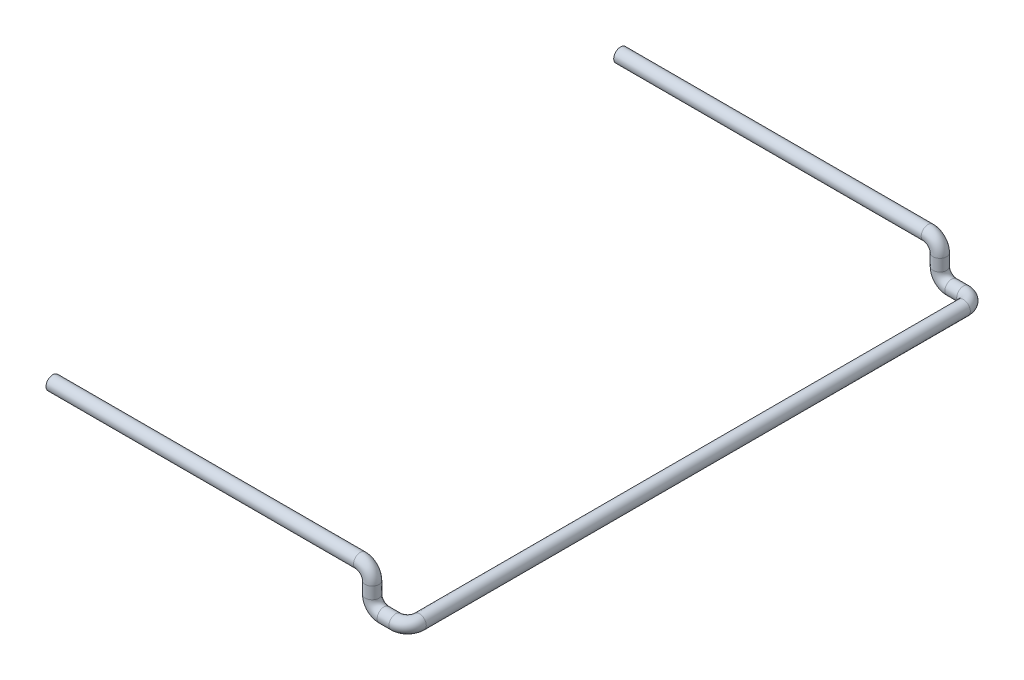
ISO-10303-21;
HEADER;
FILE_DESCRIPTION(('STEP AP214'),'2;1');
FILE_NAME('part.step','',(''),(''),'','','');
FILE_SCHEMA(('AUTOMOTIVE_DESIGN { 1 0 10303 214 1 1 1 1 }'));
ENDSEC;
DATA;
#1=APPLICATION_CONTEXT('core data for automotive mechanical design processes');
#2=APPLICATION_PROTOCOL_DEFINITION('international standard','automotive_design',2000,#1);
#3=PRODUCT_CONTEXT('',#1,'mechanical');
#4=PRODUCT('Part','Part','',(#3));
#5=PRODUCT_RELATED_PRODUCT_CATEGORY('part','',(#4));
#6=PRODUCT_DEFINITION_FORMATION('','',#4);
#7=PRODUCT_DEFINITION_CONTEXT('part definition',#1,'design');
#8=PRODUCT_DEFINITION('design','',#6,#7);
#9=PRODUCT_DEFINITION_SHAPE('','',#8);
#10=(LENGTH_UNIT() NAMED_UNIT(*) SI_UNIT(.MILLI.,.METRE.));
#11=(NAMED_UNIT(*) PLANE_ANGLE_UNIT() SI_UNIT($,.RADIAN.));
#12=(NAMED_UNIT(*) SI_UNIT($,.STERADIAN.) SOLID_ANGLE_UNIT());
#13=UNCERTAINTY_MEASURE_WITH_UNIT(LENGTH_MEASURE(1.E-05),#10,'distance_accuracy_value','');
#14=(GEOMETRIC_REPRESENTATION_CONTEXT(3) GLOBAL_UNCERTAINTY_ASSIGNED_CONTEXT((#13)) GLOBAL_UNIT_ASSIGNED_CONTEXT((#10,
#11,#12)) REPRESENTATION_CONTEXT('',''));
#15=CARTESIAN_POINT('',(0.,0.,0.));
#16=DIRECTION('',(0.,0.,1.));
#17=DIRECTION('',(1.,0.,0.));
#18=AXIS2_PLACEMENT_3D('',#15,#16,#17);
#19=CARTESIAN_POINT('',(130.,0.,240.));
#20=DIRECTION('',(-1.,0.,0.));
#21=DIRECTION('',(0.,-1.,0.));
#22=AXIS2_PLACEMENT_3D('',#19,#20,#21);
#23=CYLINDRICAL_SURFACE('',#22,2.87950634);
#24=CARTESIAN_POINT('',(130.,0.,240.));
#25=DIRECTION('',(-1.,0.,0.));
#26=DIRECTION('',(0.,0.,1.));
#27=AXIS2_PLACEMENT_3D('',#24,#25,#26);
#28=CIRCLE('',#27,2.87950634);
#29=CARTESIAN_POINT('',(130.,2.87950633999995,240.));
#30=VERTEX_POINT('',#29);
#31=EDGE_CURVE('E37',#30,#30,#28,.T.);
#32=ORIENTED_EDGE('',*,*,#31,.T.);
#33=EDGE_LOOP('',(#32));
#34=FACE_BOUND('',#33,.T.);
#35=CARTESIAN_POINT('',(0.,0.,240.));
#36=DIRECTION('',(-1.,0.,0.));
#37=DIRECTION('',(0.,0.,1.));
#38=AXIS2_PLACEMENT_3D('',#35,#36,#37);
#39=CIRCLE('',#38,2.87950634);
#40=CARTESIAN_POINT('',(0.,0.,242.87950634));
#41=VERTEX_POINT('',#40);
#42=EDGE_CURVE('E10',#41,#41,#39,.T.);
#43=ORIENTED_EDGE('',*,*,#42,.F.);
#44=EDGE_LOOP('',(#43));
#45=FACE_BOUND('',#44,.T.);
#46=ADVANCED_FACE('F31',(#34,#45),#23,.T.);
#47=CARTESIAN_POINT('',(130.,-5.,240.));
#48=DIRECTION('',(0.,0.,1.));
#49=DIRECTION('',(1.,0.,0.));
#50=AXIS2_PLACEMENT_3D('',#47,#48,#49);
#51=TOROIDAL_SURFACE('',#50,4.99999999999995,2.87950634);
#52=CARTESIAN_POINT('',(135.,-4.99999999999998,240.));
#53=DIRECTION('',(0.,1.,0.));
#54=DIRECTION('',(0.,0.,1.));
#55=AXIS2_PLACEMENT_3D('',#52,#53,#54);
#56=CIRCLE('',#55,2.87950634);
#57=CARTESIAN_POINT('',(137.87950634,-4.99999999999997,240.));
#58=VERTEX_POINT('',#57);
#59=EDGE_CURVE('E41',#58,#58,#56,.T.);
#60=CARTESIAN_POINT('',(130.,-5.,240.));
#61=DIRECTION('',(0.,0.,1.));
#62=DIRECTION('',(1.,0.,0.));
#63=AXIS2_PLACEMENT_3D('',#60,#61,#62);
#64=CIRCLE('',#63,7.87950633999995);
#65=EDGE_CURVE('',#58,#30,#64,.T.);
#66=ORIENTED_EDGE('',*,*,#59,.T.);
#67=ORIENTED_EDGE('',*,*,#31,.F.);
#68=ORIENTED_EDGE('',*,*,#65,.T.);
#69=ORIENTED_EDGE('',*,*,#65,.F.);
#70=EDGE_LOOP('',(#66,#68,#67,#69));
#71=FACE_BOUND('',#70,.T.);
#72=ADVANCED_FACE('F99',(#71),#51,.T.);
#73=CARTESIAN_POINT('',(135.,-9.99999999999998,240.));
#74=DIRECTION('',(0.,1.,0.));
#75=DIRECTION('',(0.,0.,1.));
#76=AXIS2_PLACEMENT_3D('',#73,#74,#75);
#77=CYLINDRICAL_SURFACE('',#76,2.87950634);
#78=CARTESIAN_POINT('',(135.,-9.99999999999998,240.));
#79=DIRECTION('',(0.,1.,0.));
#80=DIRECTION('',(0.,0.,1.));
#81=AXIS2_PLACEMENT_3D('',#78,#79,#80);
#82=CIRCLE('',#81,2.87950634);
#83=CARTESIAN_POINT('',(132.12049366,-9.99999999999997,240.));
#84=VERTEX_POINT('',#83);
#85=EDGE_CURVE('E45',#84,#84,#82,.T.);
#86=ORIENTED_EDGE('',*,*,#85,.T.);
#87=EDGE_LOOP('',(#86));
#88=FACE_BOUND('',#87,.T.);
#89=ORIENTED_EDGE('',*,*,#59,.F.);
#90=EDGE_LOOP('',(#89));
#91=FACE_BOUND('',#90,.T.);
#92=ADVANCED_FACE('F103',(#88,#91),#77,.T.);
#93=CARTESIAN_POINT('',(140.,-10.,240.));
#94=DIRECTION('',(0.,0.,-1.));
#95=DIRECTION('',(-1.,0.,0.));
#96=AXIS2_PLACEMENT_3D('',#93,#94,#95);
#97=TOROIDAL_SURFACE('',#96,5.00000000000004,2.87950634);
#98=CARTESIAN_POINT('',(140.,-15.,240.));
#99=DIRECTION('',(-1.,0.,0.));
#100=DIRECTION('',(0.,0.,1.));
#101=AXIS2_PLACEMENT_3D('',#98,#99,#100);
#102=CIRCLE('',#101,2.87950634);
#103=CARTESIAN_POINT('',(140.,-17.87950634,240.));
#104=VERTEX_POINT('',#103);
#105=EDGE_CURVE('E50',#104,#104,#102,.T.);
#106=CARTESIAN_POINT('',(140.,-10.,240.));
#107=DIRECTION('',(0.,0.,-1.));
#108=DIRECTION('',(-1.,0.,0.));
#109=AXIS2_PLACEMENT_3D('',#106,#107,#108);
#110=CIRCLE('',#109,7.87950634000004);
#111=EDGE_CURVE('',#104,#84,#110,.T.);
#112=ORIENTED_EDGE('',*,*,#105,.T.);
#113=ORIENTED_EDGE('',*,*,#85,.F.);
#114=ORIENTED_EDGE('',*,*,#111,.T.);
#115=ORIENTED_EDGE('',*,*,#111,.F.);
#116=EDGE_LOOP('',(#112,#114,#113,#115));
#117=FACE_BOUND('',#116,.T.);
#118=ADVANCED_FACE('F109',(#117),#97,.T.);
#119=CARTESIAN_POINT('',(145.,-15.,240.));
#120=DIRECTION('',(-1.,0.,0.));
#121=DIRECTION('',(0.,-1.,0.));
#122=AXIS2_PLACEMENT_3D('',#119,#120,#121);
#123=CYLINDRICAL_SURFACE('',#122,2.87950634);
#124=CARTESIAN_POINT('',(145.,-15.,240.));
#125=DIRECTION('',(-1.,0.,0.));
#126=DIRECTION('',(0.,0.,1.));
#127=AXIS2_PLACEMENT_3D('',#124,#125,#126);
#128=CIRCLE('',#127,2.87950634);
#129=CARTESIAN_POINT('',(145.,-15.,242.87950634));
#130=VERTEX_POINT('',#129);
#131=EDGE_CURVE('E53',#130,#130,#128,.T.);
#132=ORIENTED_EDGE('',*,*,#131,.T.);
#133=EDGE_LOOP('',(#132));
#134=FACE_BOUND('',#133,.T.);
#135=ORIENTED_EDGE('',*,*,#105,.F.);
#136=EDGE_LOOP('',(#135));
#137=FACE_BOUND('',#136,.T.);
#138=ADVANCED_FACE('F116',(#134,#137),#123,.T.);
#139=CARTESIAN_POINT('',(145.,-15.,235.));
#140=DIRECTION('',(0.,-1.,0.));
#141=DIRECTION('',(0.,0.,-1.));
#142=AXIS2_PLACEMENT_3D('',#139,#140,#141);
#143=TOROIDAL_SURFACE('',#142,4.99999999999998,2.87950634);
#144=CARTESIAN_POINT('',(150.,-15.,235.));
#145=DIRECTION('',(0.,0.,1.));
#146=DIRECTION('',(1.,0.,0.));
#147=AXIS2_PLACEMENT_3D('',#144,#145,#146);
#148=CIRCLE('',#147,2.87950634);
#149=CARTESIAN_POINT('',(152.87950634,-15.,235.));
#150=VERTEX_POINT('',#149);
#151=EDGE_CURVE('E56',#150,#150,#148,.T.);
#152=CARTESIAN_POINT('',(145.,-15.,235.));
#153=DIRECTION('',(0.,-1.,0.));
#154=DIRECTION('',(0.,0.,-1.));
#155=AXIS2_PLACEMENT_3D('',#152,#153,#154);
#156=CIRCLE('',#155,7.87950633999998);
#157=EDGE_CURVE('',#150,#130,#156,.T.);
#158=ORIENTED_EDGE('',*,*,#151,.T.);
#159=ORIENTED_EDGE('',*,*,#131,.F.);
#160=ORIENTED_EDGE('',*,*,#157,.T.);
#161=ORIENTED_EDGE('',*,*,#157,.F.);
#162=EDGE_LOOP('',(#158,#160,#159,#161));
#163=FACE_BOUND('',#162,.T.);
#164=ADVANCED_FACE('F120',(#163),#143,.T.);
#165=CARTESIAN_POINT('',(150.,-15.,4.99999999999998));
#166=DIRECTION('',(0.,0.,1.));
#167=DIRECTION('',(1.,0.,0.));
#168=AXIS2_PLACEMENT_3D('',#165,#166,#167);
#169=CYLINDRICAL_SURFACE('',#168,2.87950634);
#170=CARTESIAN_POINT('',(150.,-15.,4.99999999999998));
#171=DIRECTION('',(0.,0.,1.));
#172=DIRECTION('',(1.,0.,0.));
#173=AXIS2_PLACEMENT_3D('',#170,#171,#172);
#174=CIRCLE('',#173,2.87950634);
#175=CARTESIAN_POINT('',(152.87950634,-15.,4.99999999999996));
#176=VERTEX_POINT('',#175);
#177=EDGE_CURVE('E59',#176,#176,#174,.T.);
#178=ORIENTED_EDGE('',*,*,#177,.T.);
#179=EDGE_LOOP('',(#178));
#180=FACE_BOUND('',#179,.T.);
#181=ORIENTED_EDGE('',*,*,#151,.F.);
#182=EDGE_LOOP('',(#181));
#183=FACE_BOUND('',#182,.T.);
#184=ADVANCED_FACE('F124',(#180,#183),#169,.T.);
#185=CARTESIAN_POINT('',(145.,-15.,5.));
#186=DIRECTION('',(0.,-1.,0.));
#187=DIRECTION('',(0.,0.,-1.));
#188=AXIS2_PLACEMENT_3D('',#185,#186,#187);
#189=TOROIDAL_SURFACE('',#188,5.,2.87950634);
#190=CARTESIAN_POINT('',(145.,-15.,0.));
#191=DIRECTION('',(1.,0.,0.));
#192=DIRECTION('',(0.,0.,-1.));
#193=AXIS2_PLACEMENT_3D('',#190,#191,#192);
#194=CIRCLE('',#193,2.87950634);
#195=CARTESIAN_POINT('',(145.,-15.,-2.87950634));
#196=VERTEX_POINT('',#195);
#197=EDGE_CURVE('E62',#196,#196,#194,.T.);
#198=CARTESIAN_POINT('',(145.,-15.,5.));
#199=DIRECTION('',(0.,-1.,0.));
#200=DIRECTION('',(0.,0.,-1.));
#201=AXIS2_PLACEMENT_3D('',#198,#199,#200);
#202=CIRCLE('',#201,7.87950634);
#203=EDGE_CURVE('',#196,#176,#202,.T.);
#204=ORIENTED_EDGE('',*,*,#197,.T.);
#205=ORIENTED_EDGE('',*,*,#177,.F.);
#206=ORIENTED_EDGE('',*,*,#203,.T.);
#207=ORIENTED_EDGE('',*,*,#203,.F.);
#208=EDGE_LOOP('',(#204,#206,#205,#207));
#209=FACE_BOUND('',#208,.T.);
#210=ADVANCED_FACE('F128',(#209),#189,.T.);
#211=CARTESIAN_POINT('',(140.,-15.,0.));
#212=DIRECTION('',(1.,0.,0.));
#213=DIRECTION('',(0.,1.,0.));
#214=AXIS2_PLACEMENT_3D('',#211,#212,#213);
#215=CYLINDRICAL_SURFACE('',#214,2.87950634);
#216=CARTESIAN_POINT('',(140.,-15.,0.));
#217=DIRECTION('',(1.,0.,0.));
#218=DIRECTION('',(0.,0.,-1.));
#219=AXIS2_PLACEMENT_3D('',#216,#217,#218);
#220=CIRCLE('',#219,2.87950634);
#221=CARTESIAN_POINT('',(140.,-17.87950634,0.));
#222=VERTEX_POINT('',#221);
#223=EDGE_CURVE('E65',#222,#222,#220,.T.);
#224=ORIENTED_EDGE('',*,*,#223,.T.);
#225=EDGE_LOOP('',(#224));
#226=FACE_BOUND('',#225,.T.);
#227=ORIENTED_EDGE('',*,*,#197,.F.);
#228=EDGE_LOOP('',(#227));
#229=FACE_BOUND('',#228,.T.);
#230=ADVANCED_FACE('F132',(#226,#229),#215,.T.);
#231=CARTESIAN_POINT('',(140.,-10.,0.));
#232=DIRECTION('',(0.,0.,1.));
#233=DIRECTION('',(1.,0.,0.));
#234=AXIS2_PLACEMENT_3D('',#231,#232,#233);
#235=TOROIDAL_SURFACE('',#234,5.00000000000003,2.87950634);
#236=CARTESIAN_POINT('',(135.,-10.,0.));
#237=DIRECTION('',(0.,-1.,0.));
#238=DIRECTION('',(0.,0.,-1.));
#239=AXIS2_PLACEMENT_3D('',#236,#237,#238);
#240=CIRCLE('',#239,2.87950634);
#241=CARTESIAN_POINT('',(132.12049366,-10.,0.));
#242=VERTEX_POINT('',#241);
#243=EDGE_CURVE('E68',#242,#242,#240,.T.);
#244=CARTESIAN_POINT('',(140.,-10.,0.));
#245=DIRECTION('',(0.,0.,1.));
#246=DIRECTION('',(1.,0.,0.));
#247=AXIS2_PLACEMENT_3D('',#244,#245,#246);
#248=CIRCLE('',#247,7.87950634000003);
#249=EDGE_CURVE('',#242,#222,#248,.T.);
#250=ORIENTED_EDGE('',*,*,#243,.T.);
#251=ORIENTED_EDGE('',*,*,#223,.F.);
#252=ORIENTED_EDGE('',*,*,#249,.T.);
#253=ORIENTED_EDGE('',*,*,#249,.F.);
#254=EDGE_LOOP('',(#250,#252,#251,#253));
#255=FACE_BOUND('',#254,.T.);
#256=ADVANCED_FACE('F136',(#255),#235,.T.);
#257=CARTESIAN_POINT('',(135.,-5.,0.));
#258=DIRECTION('',(0.,-1.,0.));
#259=DIRECTION('',(0.,0.,-1.));
#260=AXIS2_PLACEMENT_3D('',#257,#258,#259);
#261=CYLINDRICAL_SURFACE('',#260,2.87950634);
#262=CARTESIAN_POINT('',(135.,-5.,0.));
#263=DIRECTION('',(0.,-1.,0.));
#264=DIRECTION('',(0.,0.,-1.));
#265=AXIS2_PLACEMENT_3D('',#262,#263,#264);
#266=CIRCLE('',#265,2.87950634);
#267=CARTESIAN_POINT('',(137.87950634,-5.00000000000001,0.));
#268=VERTEX_POINT('',#267);
#269=EDGE_CURVE('E71',#268,#268,#266,.T.);
#270=ORIENTED_EDGE('',*,*,#269,.T.);
#271=EDGE_LOOP('',(#270));
#272=FACE_BOUND('',#271,.T.);
#273=ORIENTED_EDGE('',*,*,#243,.F.);
#274=EDGE_LOOP('',(#273));
#275=FACE_BOUND('',#274,.T.);
#276=ADVANCED_FACE('F140',(#272,#275),#261,.T.);
#277=CARTESIAN_POINT('',(130.,-5.,0.));
#278=DIRECTION('',(0.,0.,-1.));
#279=DIRECTION('',(0.,1.,0.));
#280=AXIS2_PLACEMENT_3D('',#277,#278,#279);
#281=TOROIDAL_SURFACE('',#280,5.,2.87950634);
#282=CARTESIAN_POINT('',(130.,0.,0.));
#283=DIRECTION('',(1.,0.,0.));
#284=DIRECTION('',(0.,0.,-1.));
#285=AXIS2_PLACEMENT_3D('',#282,#283,#284);
#286=CIRCLE('',#285,2.87950634);
#287=CARTESIAN_POINT('',(130.,2.87950634,0.));
#288=VERTEX_POINT('',#287);
#289=EDGE_CURVE('E74',#288,#288,#286,.T.);
#290=CARTESIAN_POINT('',(130.,-5.,0.));
#291=DIRECTION('',(0.,0.,-1.));
#292=DIRECTION('',(0.,1.,0.));
#293=AXIS2_PLACEMENT_3D('',#290,#291,#292);
#294=CIRCLE('',#293,7.87950634);
#295=EDGE_CURVE('',#288,#268,#294,.T.);
#296=ORIENTED_EDGE('',*,*,#289,.T.);
#297=ORIENTED_EDGE('',*,*,#269,.F.);
#298=ORIENTED_EDGE('',*,*,#295,.T.);
#299=ORIENTED_EDGE('',*,*,#295,.F.);
#300=EDGE_LOOP('',(#296,#298,#297,#299));
#301=FACE_BOUND('',#300,.T.);
#302=ADVANCED_FACE('F81',(#301),#281,.T.);
#303=CARTESIAN_POINT('',(130.,0.,0.));
#304=DIRECTION('',(-1.,0.,0.));
#305=DIRECTION('',(0.,0.,1.));
#306=AXIS2_PLACEMENT_3D('',#303,#304,#305);
#307=CYLINDRICAL_SURFACE('',#306,2.87950634);
#308=ORIENTED_EDGE('',*,*,#289,.F.);
#309=EDGE_LOOP('',(#308));
#310=FACE_BOUND('',#309,.T.);
#311=CARTESIAN_POINT('',(0.,0.,0.));
#312=DIRECTION('',(1.,0.,0.));
#313=DIRECTION('',(0.,0.,-1.));
#314=AXIS2_PLACEMENT_3D('',#311,#312,#313);
#315=CIRCLE('',#314,2.87950634);
#316=CARTESIAN_POINT('',(0.,0.,-2.87950634));
#317=VERTEX_POINT('',#316);
#318=EDGE_CURVE('E75',#317,#317,#315,.T.);
#319=ORIENTED_EDGE('',*,*,#318,.T.);
#320=EDGE_LOOP('',(#319));
#321=FACE_BOUND('',#320,.T.);
#322=ADVANCED_FACE('F84',(#310,#321),#307,.T.);
#323=CARTESIAN_POINT('',(0.,0.,240.));
#324=DIRECTION('',(-1.,0.,0.));
#325=DIRECTION('',(0.,0.,1.));
#326=AXIS2_PLACEMENT_3D('',#323,#324,#325);
#327=PLANE('',#326);
#328=ORIENTED_EDGE('',*,*,#42,.T.);
#329=EDGE_LOOP('',(#328));
#330=FACE_BOUND('',#329,.T.);
#331=ADVANCED_FACE('F87',(#330),#327,.T.);
#332=CARTESIAN_POINT('',(0.,0.,0.));
#333=DIRECTION('',(1.,0.,0.));
#334=DIRECTION('',(0.,0.,-1.));
#335=AXIS2_PLACEMENT_3D('',#332,#333,#334);
#336=PLANE('',#335);
#337=ORIENTED_EDGE('',*,*,#318,.F.);
#338=EDGE_LOOP('',(#337));
#339=FACE_BOUND('',#338,.T.);
#340=ADVANCED_FACE('F91',(#339),#336,.F.);
#341=CLOSED_SHELL('',(#46,#72,#92,#118,#138,#164,#184,#210,#230,#256,#276,#302,#322,#331,#340));
#342=MANIFOLD_SOLID_BREP('B2',#341);
#343=ADVANCED_BREP_SHAPE_REPRESENTATION('',(#18,#342),#14);
#344=SHAPE_DEFINITION_REPRESENTATION(#9,#343);
ENDSEC;
END-ISO-10303-21;
